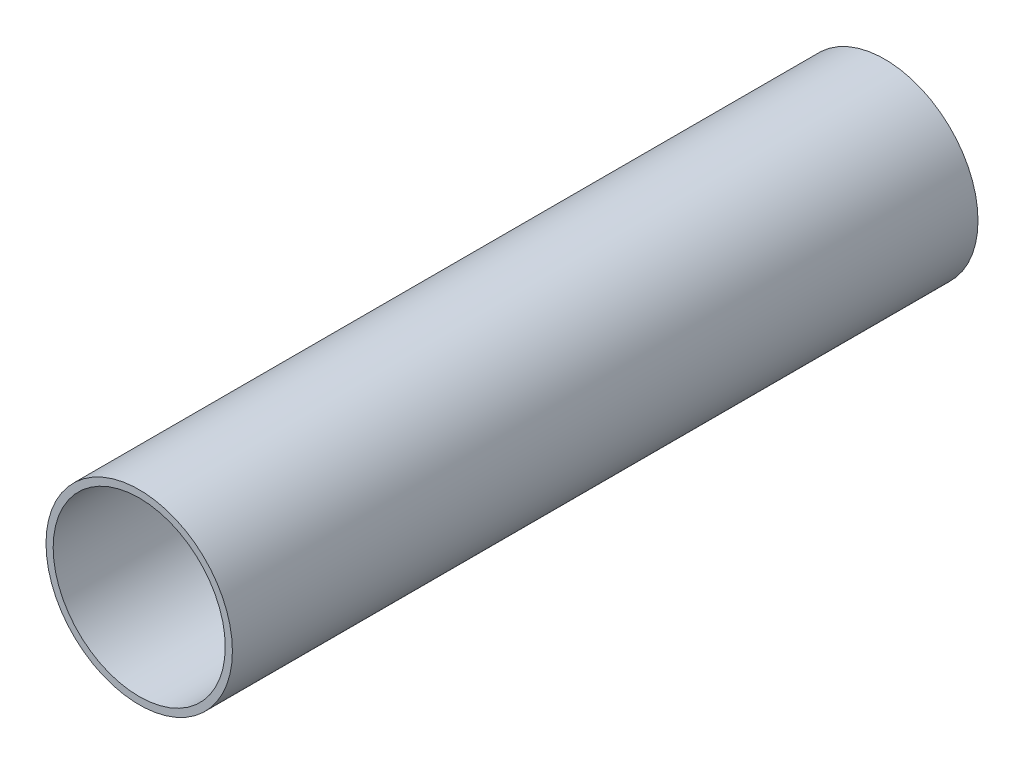
ISO-10303-21;
HEADER;
FILE_DESCRIPTION(('STEP AP214'),'2;1');
FILE_NAME('part.step','',(''),(''),'','','');
FILE_SCHEMA(('AUTOMOTIVE_DESIGN { 1 0 10303 214 1 1 1 1 }'));
ENDSEC;
DATA;
#1=APPLICATION_CONTEXT('core data for automotive mechanical design processes');
#2=APPLICATION_PROTOCOL_DEFINITION('international standard','automotive_design',2000,#1);
#3=PRODUCT_CONTEXT('',#1,'mechanical');
#4=PRODUCT('Part','Part','',(#3));
#5=PRODUCT_RELATED_PRODUCT_CATEGORY('part','',(#4));
#6=PRODUCT_DEFINITION_FORMATION('','',#4);
#7=PRODUCT_DEFINITION_CONTEXT('part definition',#1,'design');
#8=PRODUCT_DEFINITION('design','',#6,#7);
#9=PRODUCT_DEFINITION_SHAPE('','',#8);
#10=(LENGTH_UNIT() NAMED_UNIT(*) SI_UNIT(.MILLI.,.METRE.));
#11=(NAMED_UNIT(*) PLANE_ANGLE_UNIT() SI_UNIT($,.RADIAN.));
#12=(NAMED_UNIT(*) SI_UNIT($,.STERADIAN.) SOLID_ANGLE_UNIT());
#13=UNCERTAINTY_MEASURE_WITH_UNIT(LENGTH_MEASURE(1.E-05),#10,'distance_accuracy_value','');
#14=(GEOMETRIC_REPRESENTATION_CONTEXT(3) GLOBAL_UNCERTAINTY_ASSIGNED_CONTEXT((#13)) GLOBAL_UNIT_ASSIGNED_CONTEXT((#10,
#11,#12)) REPRESENTATION_CONTEXT('',''));
#15=CARTESIAN_POINT('',(0.,0.,0.));
#16=DIRECTION('',(0.,0.,1.));
#17=DIRECTION('',(1.,0.,0.));
#18=AXIS2_PLACEMENT_3D('',#15,#16,#17);
#19=CARTESIAN_POINT('',(0.,0.,100.));
#20=DIRECTION('',(0.,0.,1.));
#21=DIRECTION('',(1.,0.,0.));
#22=AXIS2_PLACEMENT_3D('',#19,#20,#21);
#23=PLANE('',#22);
#24=CARTESIAN_POINT('',(0.,0.,100.));
#25=DIRECTION('',(0.,0.,1.));
#26=DIRECTION('',(1.,0.,0.));
#27=AXIS2_PLACEMENT_3D('',#24,#25,#26);
#28=CIRCLE('',#27,12.5);
#29=CARTESIAN_POINT('',(12.5,0.,100.));
#30=VERTEX_POINT('',#29);
#31=EDGE_CURVE('E10',#30,#30,#28,.T.);
#32=ORIENTED_EDGE('',*,*,#31,.T.);
#33=EDGE_LOOP('',(#32));
#34=FACE_BOUND('',#33,.T.);
#35=CARTESIAN_POINT('',(0.,0.,100.));
#36=DIRECTION('',(0.,0.,1.));
#37=DIRECTION('',(1.,0.,0.));
#38=AXIS2_PLACEMENT_3D('',#35,#36,#37);
#39=CIRCLE('',#38,11.54);
#40=CARTESIAN_POINT('',(11.54,0.,100.));
#41=VERTEX_POINT('',#40);
#42=EDGE_CURVE('E56',#41,#41,#39,.T.);
#43=ORIENTED_EDGE('',*,*,#42,.F.);
#44=EDGE_LOOP('',(#43));
#45=FACE_BOUND('',#44,.T.);
#46=ADVANCED_FACE('F43',(#34,#45),#23,.T.);
#47=CARTESIAN_POINT('',(0.,0.,0.));
#48=DIRECTION('',(0.,0.,1.));
#49=DIRECTION('',(1.,0.,0.));
#50=AXIS2_PLACEMENT_3D('',#47,#48,#49);
#51=PLANE('',#50);
#52=CARTESIAN_POINT('',(0.,0.,0.));
#53=DIRECTION('',(0.,0.,1.));
#54=DIRECTION('',(1.,0.,0.));
#55=AXIS2_PLACEMENT_3D('',#52,#53,#54);
#56=CIRCLE('',#55,12.5);
#57=CARTESIAN_POINT('',(12.5,0.,0.));
#58=VERTEX_POINT('',#57);
#59=EDGE_CURVE('E47',#58,#58,#56,.T.);
#60=ORIENTED_EDGE('',*,*,#59,.F.);
#61=EDGE_LOOP('',(#60));
#62=FACE_BOUND('',#61,.T.);
#63=CARTESIAN_POINT('',(0.,0.,0.));
#64=DIRECTION('',(0.,0.,1.));
#65=DIRECTION('',(1.,0.,0.));
#66=AXIS2_PLACEMENT_3D('',#63,#64,#65);
#67=CIRCLE('',#66,11.54);
#68=CARTESIAN_POINT('',(11.54,0.,0.));
#69=VERTEX_POINT('',#68);
#70=EDGE_CURVE('E58',#69,#69,#67,.T.);
#71=ORIENTED_EDGE('',*,*,#70,.T.);
#72=EDGE_LOOP('',(#71));
#73=FACE_BOUND('',#72,.T.);
#74=ADVANCED_FACE('F70',(#62,#73),#51,.F.);
#75=CARTESIAN_POINT('',(0.,0.,100.));
#76=DIRECTION('',(0.,0.,-1.));
#77=DIRECTION('',(-1.,0.,0.));
#78=AXIS2_PLACEMENT_3D('',#75,#76,#77);
#79=CYLINDRICAL_SURFACE('',#78,12.5);
#80=ORIENTED_EDGE('',*,*,#31,.F.);
#81=EDGE_LOOP('',(#80));
#82=FACE_BOUND('',#81,.T.);
#83=ORIENTED_EDGE('',*,*,#59,.T.);
#84=EDGE_LOOP('',(#83));
#85=FACE_BOUND('',#84,.T.);
#86=ADVANCED_FACE('F45',(#82,#85),#79,.T.);
#87=CARTESIAN_POINT('',(0.,0.,100.));
#88=DIRECTION('',(0.,0.,-1.));
#89=DIRECTION('',(-1.,0.,0.));
#90=AXIS2_PLACEMENT_3D('',#87,#88,#89);
#91=CYLINDRICAL_SURFACE('',#90,11.54);
#92=ORIENTED_EDGE('',*,*,#42,.T.);
#93=EDGE_LOOP('',(#92));
#94=FACE_BOUND('',#93,.T.);
#95=ORIENTED_EDGE('',*,*,#70,.F.);
#96=EDGE_LOOP('',(#95));
#97=FACE_BOUND('',#96,.T.);
#98=ADVANCED_FACE('F66',(#94,#97),#91,.F.);
#99=CLOSED_SHELL('',(#46,#74,#86,#98));
#100=MANIFOLD_SOLID_BREP('B2',#99);
#101=ADVANCED_BREP_SHAPE_REPRESENTATION('',(#18,#100),#14);
#102=SHAPE_DEFINITION_REPRESENTATION(#9,#101);
ENDSEC;
END-ISO-10303-21;
